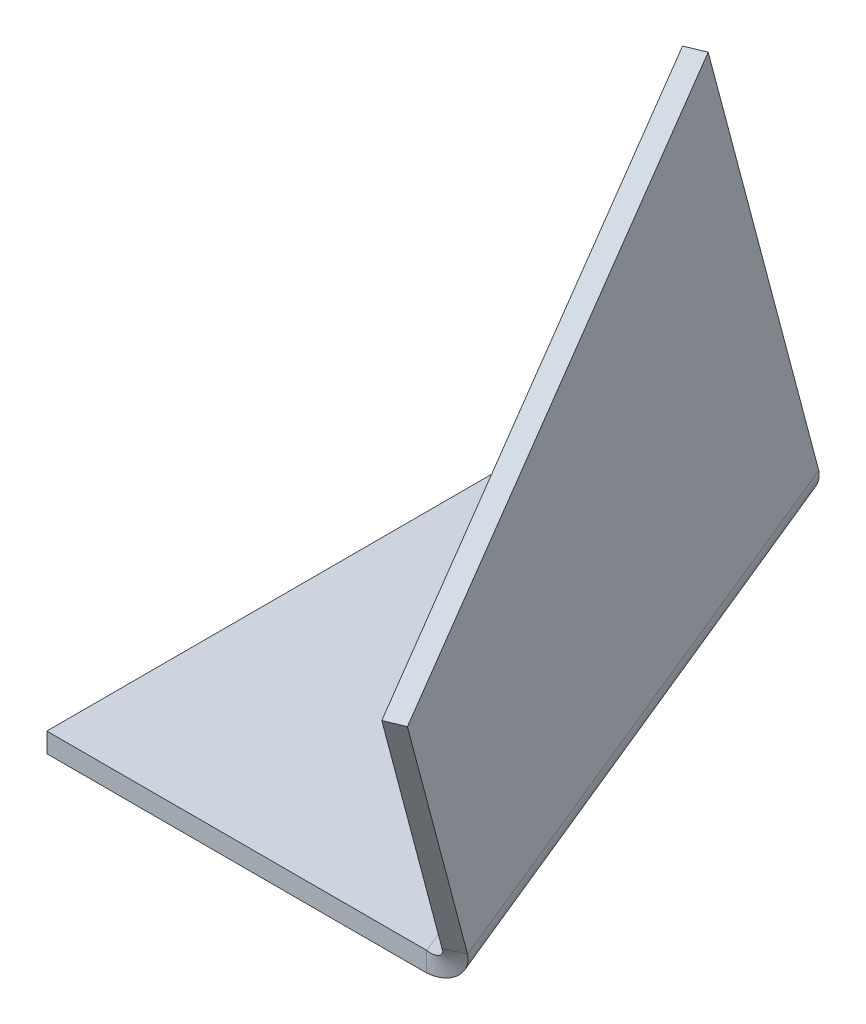
ISO-10303-21;
HEADER;
FILE_DESCRIPTION(('STEP AP214'),'2;1');
FILE_NAME('part.step','',(''),(''),'','','');
FILE_SCHEMA(('AUTOMOTIVE_DESIGN { 1 0 10303 214 1 1 1 1 }'));
ENDSEC;
DATA;
#1=APPLICATION_CONTEXT('core data for automotive mechanical design processes');
#2=APPLICATION_PROTOCOL_DEFINITION('international standard','automotive_design',2000,#1);
#3=PRODUCT_CONTEXT('',#1,'mechanical');
#4=PRODUCT('Part','Part','',(#3));
#5=PRODUCT_RELATED_PRODUCT_CATEGORY('part','',(#4));
#6=PRODUCT_DEFINITION_FORMATION('','',#4);
#7=PRODUCT_DEFINITION_CONTEXT('part definition',#1,'design');
#8=PRODUCT_DEFINITION('design','',#6,#7);
#9=PRODUCT_DEFINITION_SHAPE('','',#8);
#10=(LENGTH_UNIT() NAMED_UNIT(*) SI_UNIT(.MILLI.,.METRE.));
#11=(NAMED_UNIT(*) PLANE_ANGLE_UNIT() SI_UNIT($,.RADIAN.));
#12=(NAMED_UNIT(*) SI_UNIT($,.STERADIAN.) SOLID_ANGLE_UNIT());
#13=UNCERTAINTY_MEASURE_WITH_UNIT(LENGTH_MEASURE(1.E-05),#10,'distance_accuracy_value','');
#14=(GEOMETRIC_REPRESENTATION_CONTEXT(3) GLOBAL_UNCERTAINTY_ASSIGNED_CONTEXT((#13)) GLOBAL_UNIT_ASSIGNED_CONTEXT((#10,
#11,#12)) REPRESENTATION_CONTEXT('',''));
#15=CARTESIAN_POINT('',(0.,0.,0.));
#16=DIRECTION('',(0.,0.,1.));
#17=DIRECTION('',(1.,0.,0.));
#18=AXIS2_PLACEMENT_3D('',#15,#16,#17);
#19=CARTESIAN_POINT('',(27.614547148129,-28.8222551031897,-11.3048892376136));
#20=DIRECTION('',(-0.925452630765146,0.,0.378863337114942));
#21=DIRECTION('',(0.350620072033487,-0.378863337114942,0.856462571790129));
#22=AXIS2_PLACEMENT_3D('',#19,#20,#21);
#23=PLANE('',#22);
#24=DIRECTION('',(0.143537428209867,0.925452630765146,0.350620072033487));
#25=VECTOR('',#24,1.);
#26=CARTESIAN_POINT('',(27.614547148129,-28.8222551031897,-11.3048892376136));
#27=LINE('',#26,#25);
#28=CARTESIAN_POINT('',(32.3254299950118,1.55100000000001,0.202423549824353));
#29=VERTEX_POINT('',#28);
#30=CARTESIAN_POINT('',(35.5103451127041,22.0856306617845,7.98224224877086));
#31=VERTEX_POINT('',#30);
#32=EDGE_CURVE('E74',#29,#31,#27,.T.);
#33=ORIENTED_EDGE('',*,*,#32,.F.);
#34=DIRECTION('',(-0.378863337114942,0.,-0.925452630765146));
#35=VECTOR('',#34,1.);
#36=CARTESIAN_POINT('',(27.6145471481289,1.55100000000001,-11.3048892376135));
#37=LINE('',#36,#35);
#38=CARTESIAN_POINT('',(13.7440473836242,1.55100000000001,-45.1864745998673));
#39=VERTEX_POINT('',#38);
#40=EDGE_CURVE('E67',#29,#39,#37,.T.);
#41=ORIENTED_EDGE('',*,*,#40,.T.);
#42=DIRECTION('',(0.143537428209867,0.925452630765146,0.350620072033487));
#43=VECTOR('',#42,1.);
#44=CARTESIAN_POINT('',(11.7002884093635,-11.6260656822273,-50.1787816776187));
#45=LINE('',#44,#43);
#46=CARTESIAN_POINT('',(19.5960863739386,39.2818200827469,-30.8916501912343));
#47=VERTEX_POINT('',#46);
#48=EDGE_CURVE('E82',#39,#47,#45,.T.);
#49=ORIENTED_EDGE('',*,*,#48,.T.);
#50=DIRECTION('',(0.350620072033487,-0.378863337114942,0.856462571790129));
#51=VECTOR('',#50,1.);
#52=CARTESIAN_POINT('',(35.5103451127041,22.0856306617845,7.98224224877086));
#53=LINE('',#52,#51);
#54=EDGE_CURVE('E450',#31,#47,#53,.F.);
#55=ORIENTED_EDGE('',*,*,#54,.F.);
#56=EDGE_LOOP('',(#33,#41,#49,#55));
#57=FACE_BOUND('',#56,.T.);
#58=ADVANCED_FACE('F55',(#57),#23,.F.);
#59=CARTESIAN_POINT('',(10.3121094632158,-11.6260656822273,-49.6104866719463));
#60=DIRECTION('',(0.350620072033487,-0.378863337114942,0.856462571790129));
#61=DIRECTION('',(0.143537428209867,0.925452630765146,0.350620072033487));
#62=AXIS2_PLACEMENT_3D('',#59,#60,#61);
#63=PLANE('',#62);
#64=CARTESIAN_POINT('',(12.3558684374765,1.55100000000001,-44.6181795941948));
#65=CARTESIAN_POINT('',(13.7440473836242,1.55100000000001,-45.1864745998673));
#66=B_SPLINE_CURVE_WITH_KNOTS('',1,(#64,#65),.UNSPECIFIED.,.F.,.F.,(2,2),(0.,1.),.UNSPECIFIED.);
#67=CARTESIAN_POINT('',(12.3558684374765,1.55100000000001,-44.6181795941949));
#68=VERTEX_POINT('',#67);
#69=EDGE_CURVE('E416',#68,#39,#66,.T.);
#70=ORIENTED_EDGE('',*,*,#69,.F.);
#71=DIRECTION('',(0.143537428209867,0.925452630765146,0.350620072033487));
#72=VECTOR('',#71,1.);
#73=CARTESIAN_POINT('',(10.3121094632158,-11.6260656822273,-49.6104866719463));
#74=LINE('',#73,#72);
#75=CARTESIAN_POINT('',(18.2079074277909,39.2818200827469,-30.3233551855619));
#76=VERTEX_POINT('',#75);
#77=EDGE_CURVE('E466',#68,#76,#74,.T.);
#78=ORIENTED_EDGE('',*,*,#77,.T.);
#79=DIRECTION('',(-0.925452630765146,0.,0.378863337114942));
#80=VECTOR('',#79,1.);
#81=CARTESIAN_POINT('',(18.2079074277909,39.2818200827469,-30.3233551855619));
#82=LINE('',#81,#80);
#83=EDGE_CURVE('E474',#47,#76,#82,.T.);
#84=ORIENTED_EDGE('',*,*,#83,.F.);
#85=ORIENTED_EDGE('',*,*,#48,.F.);
#86=EDGE_LOOP('',(#70,#78,#84,#85));
#87=FACE_BOUND('',#86,.T.);
#88=ADVANCED_FACE('F209',(#87),#63,.F.);
#89=CARTESIAN_POINT('',(26.2263682019813,-28.8222551031897,-10.7365942319412));
#90=DIRECTION('',(0.350620072033487,-0.378863337114942,0.856462571790129));
#91=DIRECTION('',(0.143537428209867,0.925452630765146,0.350620072033487));
#92=AXIS2_PLACEMENT_3D('',#89,#90,#91);
#93=PLANE('',#92);
#94=CARTESIAN_POINT('',(32.3254299950118,1.55100000000001,0.202423549824353));
#95=CARTESIAN_POINT('',(30.9372510488641,1.55100000000001,0.77071855549677));
#96=B_SPLINE_CURVE_WITH_KNOTS('',1,(#94,#95),.UNSPECIFIED.,.F.,.F.,(2,2),(0.,1.),.UNSPECIFIED.);
#97=CARTESIAN_POINT('',(30.9372510488641,1.551,0.770718555496767));
#98=VERTEX_POINT('',#97);
#99=EDGE_CURVE('E12',#29,#98,#96,.T.);
#100=ORIENTED_EDGE('',*,*,#99,.F.);
#101=ORIENTED_EDGE('',*,*,#32,.T.);
#102=DIRECTION('',(-0.925452630765146,0.,0.378863337114942));
#103=VECTOR('',#102,1.);
#104=CARTESIAN_POINT('',(34.1221661665564,22.0856306617845,8.55053725444327));
#105=LINE('',#104,#103);
#106=CARTESIAN_POINT('',(34.1221661665564,22.0856306617845,8.55053725444327));
#107=VERTEX_POINT('',#106);
#108=EDGE_CURVE('E472',#31,#107,#105,.T.);
#109=ORIENTED_EDGE('',*,*,#108,.T.);
#110=DIRECTION('',(0.143537428209867,0.925452630765146,0.350620072033487));
#111=VECTOR('',#110,1.);
#112=CARTESIAN_POINT('',(26.2263682019813,-28.8222551031897,-10.7365942319412));
#113=LINE('',#112,#111);
#114=EDGE_CURVE('E463',#98,#107,#113,.T.);
#115=ORIENTED_EDGE('',*,*,#114,.F.);
#116=EDGE_LOOP('',(#100,#101,#109,#115));
#117=FACE_BOUND('',#116,.T.);
#118=ADVANCED_FACE('F57',(#117),#93,.T.);
#119=CARTESIAN_POINT('',(34.1221661665564,22.0856306617845,8.55053725444327));
#120=DIRECTION('',(0.143537428209867,0.925452630765146,0.350620072033487));
#121=DIRECTION('',(-0.350620072033487,0.378863337114942,-0.856462571790129));
#122=AXIS2_PLACEMENT_3D('',#119,#120,#121);
#123=PLANE('',#122);
#124=ORIENTED_EDGE('',*,*,#54,.T.);
#125=ORIENTED_EDGE('',*,*,#83,.T.);
#126=DIRECTION('',(-0.350620072033487,0.378863337114942,-0.856462571790129));
#127=VECTOR('',#126,1.);
#128=CARTESIAN_POINT('',(34.1221661665564,22.0856306617845,8.55053725444327));
#129=LINE('',#128,#127);
#130=EDGE_CURVE('E471',#107,#76,#129,.T.);
#131=ORIENTED_EDGE('',*,*,#130,.F.);
#132=ORIENTED_EDGE('',*,*,#108,.F.);
#133=EDGE_LOOP('',(#124,#125,#131,#132));
#134=FACE_BOUND('',#133,.T.);
#135=ADVANCED_FACE('F201',(#134),#123,.T.);
#136=CARTESIAN_POINT('',(26.2263682019813,-28.8222551031897,-10.7365942319412));
#137=DIRECTION('',(-0.925452630765146,0.,0.378863337114942));
#138=DIRECTION('',(0.350620072033487,-0.378863337114942,0.856462571790129));
#139=AXIS2_PLACEMENT_3D('',#136,#137,#138);
#140=PLANE('',#139);
#141=DIRECTION('',(-0.378863337114942,0.,-0.925452630765146));
#142=VECTOR('',#141,1.);
#143=CARTESIAN_POINT('',(26.2263682019812,1.551,-10.7365942319411));
#144=LINE('',#143,#142);
#145=EDGE_CURVE('E151',#98,#68,#144,.T.);
#146=ORIENTED_EDGE('',*,*,#145,.F.);
#147=ORIENTED_EDGE('',*,*,#114,.T.);
#148=ORIENTED_EDGE('',*,*,#130,.T.);
#149=ORIENTED_EDGE('',*,*,#77,.F.);
#150=EDGE_LOOP('',(#146,#147,#148,#149));
#151=FACE_BOUND('',#150,.T.);
#152=ADVANCED_FACE('F204',(#151),#140,.T.);
#153=CARTESIAN_POINT('',(0.,0.051,0.));
#154=DIRECTION('',(1.,0.,0.));
#155=DIRECTION('',(0.,0.,-1.));
#156=AXIS2_PLACEMENT_3D('',#153,#154,#155);
#157=PLANE('',#156);
#158=DIRECTION('',(0.,1.,0.));
#159=VECTOR('',#158,1.);
#160=CARTESIAN_POINT('',(0.,0.051,-45.3888981496916));
#161=LINE('',#160,#159);
#162=CARTESIAN_POINT('',(0.,-1.449,-45.3888981496916));
#163=VERTEX_POINT('',#162);
#164=CARTESIAN_POINT('',(0.,0.051,-45.3888981496916));
#165=VERTEX_POINT('',#164);
#166=EDGE_CURVE('E139',#163,#165,#161,.T.);
#167=ORIENTED_EDGE('',*,*,#166,.F.);
#168=DIRECTION('',(0.,0.,1.));
#169=VECTOR('',#168,1.);
#170=CARTESIAN_POINT('',(0.,-1.449,0.));
#171=LINE('',#170,#169);
#172=CARTESIAN_POINT('',(0.,-1.449,0.));
#173=VERTEX_POINT('',#172);
#174=EDGE_CURVE('E420',#173,#163,#171,.F.);
#175=ORIENTED_EDGE('',*,*,#174,.F.);
#176=DIRECTION('',(0.,1.,0.));
#177=VECTOR('',#176,1.);
#178=CARTESIAN_POINT('',(0.,0.051,0.));
#179=LINE('',#178,#177);
#180=CARTESIAN_POINT('',(0.,0.051,0.));
#181=VERTEX_POINT('',#180);
#182=EDGE_CURVE('E431',#173,#181,#179,.T.);
#183=ORIENTED_EDGE('',*,*,#182,.T.);
#184=DIRECTION('',(0.,0.,-1.));
#185=VECTOR('',#184,1.);
#186=CARTESIAN_POINT('',(0.,0.051,0.));
#187=LINE('',#186,#185);
#188=EDGE_CURVE('E175',#181,#165,#187,.T.);
#189=ORIENTED_EDGE('',*,*,#188,.T.);
#190=EDGE_LOOP('',(#167,#175,#183,#189));
#191=FACE_BOUND('',#190,.T.);
#192=ADVANCED_FACE('F207',(#191),#157,.F.);
#193=CARTESIAN_POINT('',(0.,0.051,0.));
#194=DIRECTION('',(0.,1.,0.));
#195=DIRECTION('',(0.,0.,1.));
#196=AXIS2_PLACEMENT_3D('',#193,#194,#195);
#197=PLANE('',#196);
#198=DIRECTION('',(1.,0.,0.));
#199=VECTOR('',#198,1.);
#200=CARTESIAN_POINT('',(0.,0.051,0.));
#201=LINE('',#200,#199);
#202=CARTESIAN_POINT('',(29.0009045041141,0.051,0.));
#203=VERTEX_POINT('',#202);
#204=EDGE_CURVE('E164',#181,#203,#201,.T.);
#205=ORIENTED_EDGE('',*,*,#204,.T.);
#206=DIRECTION('',(-0.378863337114942,0.,-0.925452630765146));
#207=VECTOR('',#206,1.);
#208=CARTESIAN_POINT('',(24.8381892558335,0.051,-10.1682992262687));
#209=LINE('',#208,#207);
#210=CARTESIAN_POINT('',(10.4195218927265,0.051,-45.3888981496916));
#211=VERTEX_POINT('',#210);
#212=EDGE_CURVE('E149',#203,#211,#209,.T.);
#213=ORIENTED_EDGE('',*,*,#212,.T.);
#214=DIRECTION('',(1.,0.,0.));
#215=VECTOR('',#214,1.);
#216=CARTESIAN_POINT('',(0.,0.051,-45.3888981496916));
#217=LINE('',#216,#215);
#218=EDGE_CURVE('E140',#165,#211,#217,.T.);
#219=ORIENTED_EDGE('',*,*,#218,.F.);
#220=ORIENTED_EDGE('',*,*,#188,.F.);
#221=EDGE_LOOP('',(#205,#213,#219,#220));
#222=FACE_BOUND('',#221,.T.);
#223=ADVANCED_FACE('F160',(#222),#197,.T.);
#224=CARTESIAN_POINT('',(0.,0.051,-45.3888981496916));
#225=DIRECTION('',(0.,0.,1.));
#226=DIRECTION('',(1.,0.,0.));
#227=AXIS2_PLACEMENT_3D('',#224,#225,#226);
#228=PLANE('',#227);
#229=ORIENTED_EDGE('',*,*,#218,.T.);
#230=CARTESIAN_POINT('',(10.4195218927265,-1.449,-45.3888981496916));
#231=CARTESIAN_POINT('',(10.4195218927265,0.051,-45.3888981496916));
#232=B_SPLINE_CURVE_WITH_KNOTS('',1,(#230,#231),.UNSPECIFIED.,.F.,.F.,(2,2),(0.,1.),.UNSPECIFIED.);
#233=CARTESIAN_POINT('',(10.4195218927265,-1.449,-45.3888981496916));
#234=VERTEX_POINT('',#233);
#235=EDGE_CURVE('E124',#211,#234,#232,.F.);
#236=ORIENTED_EDGE('',*,*,#235,.T.);
#237=DIRECTION('',(1.,0.,0.));
#238=VECTOR('',#237,1.);
#239=CARTESIAN_POINT('',(0.,-1.449,-45.3888981496916));
#240=LINE('',#239,#238);
#241=EDGE_CURVE('E428',#163,#234,#240,.T.);
#242=ORIENTED_EDGE('',*,*,#241,.F.);
#243=ORIENTED_EDGE('',*,*,#166,.T.);
#244=EDGE_LOOP('',(#229,#236,#242,#243));
#245=FACE_BOUND('',#244,.T.);
#246=ADVANCED_FACE('F167',(#245),#228,.F.);
#247=CARTESIAN_POINT('',(0.,-1.449,0.));
#248=DIRECTION('',(0.,1.,0.));
#249=DIRECTION('',(0.,0.,1.));
#250=AXIS2_PLACEMENT_3D('',#247,#248,#249);
#251=PLANE('',#250);
#252=DIRECTION('',(-0.378863337114942,0.,-0.925452630765146));
#253=VECTOR('',#252,1.);
#254=CARTESIAN_POINT('',(24.8381892558335,-1.449,-10.1682992262687));
#255=LINE('',#254,#253);
#256=CARTESIAN_POINT('',(29.0009045041141,-1.449,0.));
#257=VERTEX_POINT('',#256);
#258=EDGE_CURVE('E153',#257,#234,#255,.T.);
#259=ORIENTED_EDGE('',*,*,#258,.F.);
#260=DIRECTION('',(1.,0.,0.));
#261=VECTOR('',#260,1.);
#262=CARTESIAN_POINT('',(0.,-1.449,0.));
#263=LINE('',#262,#261);
#264=EDGE_CURVE('E186',#173,#257,#263,.T.);
#265=ORIENTED_EDGE('',*,*,#264,.F.);
#266=ORIENTED_EDGE('',*,*,#174,.T.);
#267=ORIENTED_EDGE('',*,*,#241,.T.);
#268=EDGE_LOOP('',(#259,#265,#266,#267));
#269=FACE_BOUND('',#268,.T.);
#270=ADVANCED_FACE('F199',(#269),#251,.F.);
#271=CARTESIAN_POINT('',(0.,0.051,0.));
#272=DIRECTION('',(0.,0.,1.));
#273=DIRECTION('',(1.,0.,0.));
#274=AXIS2_PLACEMENT_3D('',#271,#272,#273);
#275=PLANE('',#274);
#276=ORIENTED_EDGE('',*,*,#264,.T.);
#277=CARTESIAN_POINT('',(29.0009045041141,0.051,0.));
#278=CARTESIAN_POINT('',(29.0009045041141,-1.449,0.));
#279=B_SPLINE_CURVE_WITH_KNOTS('',1,(#277,#278),.UNSPECIFIED.,.F.,.F.,(2,2),(0.,1.),.UNSPECIFIED.);
#280=EDGE_CURVE('E181',#257,#203,#279,.F.);
#281=ORIENTED_EDGE('',*,*,#280,.T.);
#282=ORIENTED_EDGE('',*,*,#204,.F.);
#283=ORIENTED_EDGE('',*,*,#182,.F.);
#284=EDGE_LOOP('',(#276,#281,#282,#283));
#285=FACE_BOUND('',#284,.T.);
#286=ADVANCED_FACE('F188',(#285),#275,.T.);
#287=CARTESIAN_POINT('',(29.0009045041141,-1.449,0.));
#288=CARTESIAN_POINT('',(29.4100769416565,-1.449,-0.0372009495371875));
#289=CARTESIAN_POINT('',(29.8189715750803,-1.37091803000495,-0.0743311039918696));
#290=CARTESIAN_POINT('',(30.581853567844,-1.07035916506277,-0.126070448890172));
#291=CARTESIAN_POINT('',(30.935509306385,-0.848000527194538,-0.140565346274388));
#292=CARTESIAN_POINT('',(31.5408302857312,-0.29264015992474,-0.127802101458073));
#293=CARTESIAN_POINT('',(31.7922933053366,0.0401430588873094,-0.100461173606402));
#294=CARTESIAN_POINT('',(32.1618075640309,0.76575634692217,0.00883701868365594));
#295=CARTESIAN_POINT('',(32.2797418352391,1.15823621535432,0.0908207012127801));
#296=CARTESIAN_POINT('',(32.3254299950118,1.55100000000001,0.202423549824353));
#297=CARTESIAN_POINT('',(29.0009045041141,0.051,0.));
#298=CARTESIAN_POINT('',(29.2283271082656,0.0510000000000001,0.037199690940906));
#299=CARTESIAN_POINT('',(29.4556186728141,0.090040984997527,0.0744189114348337));
#300=CARTESIAN_POINT('',(29.8827403024128,0.240320417468615,0.160133702416447));
#301=CARTESIAN_POINT('',(30.0824084882917,0.351499736402731,0.208678485439724));
#302=CARTESIAN_POINT('',(30.4307496111817,0.62917992003763,0.326644571278646));
#303=CARTESIAN_POINT('',(30.5793214375928,0.795571529443655,0.396107266919863));
#304=CARTESIAN_POINT('',(30.8097592001568,1.15837817346108,0.562340826495657));
#305=CARTESIAN_POINT('',(30.8915644348301,1.35462475174201,0.659119482674068));
#306=CARTESIAN_POINT('',(30.9372510488641,1.55100000000001,0.77071855549677));
#307=B_SPLINE_SURFACE_WITH_KNOTS('',1,3,((#287,#288,#289,#290,#291,#292,#293,#294,#295,#296),
(#297,#298,#299,#300,#301,#302,#303,#304,#305,#306)),.UNSPECIFIED.,.F.,.F.,.F.,(2,2),(4,2,2,2,
4),(0.,1.),(0.,0.25,0.5,0.75,1.),.UNSPECIFIED.);
#308=CARTESIAN_POINT('',(29.0009045041141,-1.449,0.));
#309=CARTESIAN_POINT('',(29.4100769416565,-1.449,-0.0372009495371875));
#310=CARTESIAN_POINT('',(29.8189715750803,-1.37091803000495,-0.0743311039918696));
#311=CARTESIAN_POINT('',(30.581853567844,-1.07035916506277,-0.126070448890172));
#312=CARTESIAN_POINT('',(30.935509306385,-0.848000527194538,-0.140565346274388));
#313=CARTESIAN_POINT('',(31.5408302857312,-0.29264015992474,-0.127802101458073));
#314=CARTESIAN_POINT('',(31.7922933053366,0.0401430588873094,-0.100461173606402));
#315=CARTESIAN_POINT('',(32.1618075640309,0.76575634692217,0.00883701868365594));
#316=CARTESIAN_POINT('',(32.2797418352391,1.15823621535432,0.0908207012127801));
#317=CARTESIAN_POINT('',(32.3254299950118,1.55100000000001,0.202423549824353));
#318=B_SPLINE_CURVE_WITH_KNOTS('',3,(#308,#309,#310,#311,#312,#313,#314,#315,#316,#317),
.UNSPECIFIED.,.F.,.F.,(4,2,2,2,4),(0.,0.25,0.5,0.75,1.),.UNSPECIFIED.);
#319=EDGE_CURVE('E497',#257,#29,#318,.T.);
#320=CARTESIAN_POINT('',(30.9372510488641,1.55100000000001,0.77071855549677));
#321=CARTESIAN_POINT('',(30.8915644348301,1.35462475174201,0.659119482674068));
#322=CARTESIAN_POINT('',(30.8097592001568,1.15837817346108,0.562340826495657));
#323=CARTESIAN_POINT('',(30.5793214375928,0.795571529443655,0.396107266919863));
#324=CARTESIAN_POINT('',(30.4307496111817,0.62917992003763,0.326644571278646));
#325=CARTESIAN_POINT('',(30.0824084882917,0.351499736402731,0.208678485439724));
#326=CARTESIAN_POINT('',(29.8827403024128,0.240320417468615,0.160133702416447));
#327=CARTESIAN_POINT('',(29.4556186728141,0.090040984997527,0.0744189114348337));
#328=CARTESIAN_POINT('',(29.2283271082656,0.0510000000000001,0.037199690940906));
#329=CARTESIAN_POINT('',(29.0009045041141,0.051,0.));
#330=B_SPLINE_CURVE_WITH_KNOTS('',3,(#320,#321,#322,#323,#324,#325,#326,#327,#328,#329),
.UNSPECIFIED.,.F.,.F.,(4,2,2,2,4),(0.,0.25,0.5,0.75,1.),.UNSPECIFIED.);
#331=EDGE_CURVE('E154',#203,#98,#330,.F.);
#332=ORIENTED_EDGE('',*,*,#280,.F.);
#333=ORIENTED_EDGE('',*,*,#319,.T.);
#334=ORIENTED_EDGE('',*,*,#99,.T.);
#335=ORIENTED_EDGE('',*,*,#331,.F.);
#336=EDGE_LOOP('',(#332,#333,#334,#335));
#337=FACE_BOUND('',#336,.T.);
#338=ADVANCED_FACE('F198',(#337),#307,.F.);
#339=CARTESIAN_POINT('',(13.7440473836242,1.55100000000001,-45.1864745998673));
#340=CARTESIAN_POINT('',(13.6983592238515,1.15823621535431,-45.2980774484788));
#341=CARTESIAN_POINT('',(13.5804249526433,0.765756346922169,-45.380061131008));
#342=CARTESIAN_POINT('',(13.210910693949,0.0401430588873099,-45.489359323298));
#343=CARTESIAN_POINT('',(12.9594476743436,-0.292640159924741,-45.5167002511497));
#344=CARTESIAN_POINT('',(12.3541266949974,-0.848000527194537,-45.529463495966));
#345=CARTESIAN_POINT('',(12.0004709564564,-1.07035916506277,-45.5149685985818));
#346=CARTESIAN_POINT('',(11.2375889636927,-1.37091803000495,-45.4632292536835));
#347=CARTESIAN_POINT('',(10.8286943302689,-1.449,-45.4260990992288));
#348=CARTESIAN_POINT('',(10.4195218927265,-1.449,-45.3888981496916));
#349=CARTESIAN_POINT('',(12.3558684374765,1.55100000000001,-44.6181795941948));
#350=CARTESIAN_POINT('',(12.3101818234425,1.354624751742,-44.7297786670175));
#351=CARTESIAN_POINT('',(12.2283765887692,1.15837817346108,-44.8265573231959));
#352=CARTESIAN_POINT('',(11.9979388262052,0.795571529443655,-44.9927908827717));
#353=CARTESIAN_POINT('',(11.8493669997941,0.62917992003763,-45.062253578413));
#354=CARTESIAN_POINT('',(11.5010258769041,0.351499736402731,-45.1802196642519));
#355=CARTESIAN_POINT('',(11.3013576910252,0.240320417468614,-45.2287644472752));
#356=CARTESIAN_POINT('',(10.8742360614265,0.090040984997527,-45.3144792382568));
#357=CARTESIAN_POINT('',(10.646944496878,0.0510000000000001,-45.3516984587507));
#358=CARTESIAN_POINT('',(10.4195218927265,0.051,-45.3888981496916));
#359=B_SPLINE_SURFACE_WITH_KNOTS('',1,3,((#339,#340,#341,#342,#343,#344,#345,#346,#347,#348),
(#349,#350,#351,#352,#353,#354,#355,#356,#357,#358)),.UNSPECIFIED.,.F.,.F.,.F.,(2,2),(4,2,2,2,
4),(0.,1.),(0.,0.25,0.5,0.75,1.),.UNSPECIFIED.);
#360=CARTESIAN_POINT('',(13.7440473836242,1.55100000000001,-45.1864745998673));
#361=CARTESIAN_POINT('',(13.6983592238515,1.15823621535431,-45.2980774484788));
#362=CARTESIAN_POINT('',(13.5804249526433,0.765756346922169,-45.380061131008));
#363=CARTESIAN_POINT('',(13.210910693949,0.0401430588873099,-45.489359323298));
#364=CARTESIAN_POINT('',(12.9594476743436,-0.292640159924741,-45.5167002511497));
#365=CARTESIAN_POINT('',(12.3541266949974,-0.848000527194537,-45.529463495966));
#366=CARTESIAN_POINT('',(12.0004709564564,-1.07035916506277,-45.5149685985818));
#367=CARTESIAN_POINT('',(11.2375889636927,-1.37091803000495,-45.4632292536835));
#368=CARTESIAN_POINT('',(10.8286943302689,-1.449,-45.4260990992288));
#369=CARTESIAN_POINT('',(10.4195218927265,-1.449,-45.3888981496916));
#370=B_SPLINE_CURVE_WITH_KNOTS('',3,(#360,#361,#362,#363,#364,#365,#366,#367,#368,#369),
.UNSPECIFIED.,.F.,.F.,(4,2,2,2,4),(0.,0.25,0.5,0.75,1.),.UNSPECIFIED.);
#371=EDGE_CURVE('E132',#39,#234,#370,.T.);
#372=CARTESIAN_POINT('',(10.4195218927265,0.051,-45.3888981496916));
#373=CARTESIAN_POINT('',(10.646944496878,0.0510000000000001,-45.3516984587507));
#374=CARTESIAN_POINT('',(10.8742360614265,0.090040984997527,-45.3144792382568));
#375=CARTESIAN_POINT('',(11.3013576910252,0.240320417468614,-45.2287644472752));
#376=CARTESIAN_POINT('',(11.5010258769041,0.351499736402731,-45.1802196642519));
#377=CARTESIAN_POINT('',(11.8493669997941,0.62917992003763,-45.062253578413));
#378=CARTESIAN_POINT('',(11.9979388262052,0.795571529443655,-44.9927908827717));
#379=CARTESIAN_POINT('',(12.2283765887692,1.15837817346108,-44.8265573231959));
#380=CARTESIAN_POINT('',(12.3101818234425,1.354624751742,-44.7297786670175));
#381=CARTESIAN_POINT('',(12.3558684374765,1.55100000000001,-44.6181795941948));
#382=B_SPLINE_CURVE_WITH_KNOTS('',3,(#372,#373,#374,#375,#376,#377,#378,#379,#380,#381),
.UNSPECIFIED.,.F.,.F.,(4,2,2,2,4),(0.,0.25,0.5,0.75,1.),.UNSPECIFIED.);
#383=EDGE_CURVE('E129',#68,#211,#382,.F.);
#384=ORIENTED_EDGE('',*,*,#371,.T.);
#385=ORIENTED_EDGE('',*,*,#235,.F.);
#386=ORIENTED_EDGE('',*,*,#383,.F.);
#387=ORIENTED_EDGE('',*,*,#69,.T.);
#388=EDGE_LOOP('',(#384,#385,#386,#387));
#389=FACE_BOUND('',#388,.T.);
#390=ADVANCED_FACE('F127',(#389),#359,.F.);
#391=CARTESIAN_POINT('',(38.8949886145411,1.551,24.1683617072409));
#392=DIRECTION('',(-0.378863337114942,0.,-0.925452630765146));
#393=DIRECTION('',(-0.925452630765146,0.,0.378863337114942));
#394=AXIS2_PLACEMENT_3D('',#391,#392,#393);
#395=CYLINDRICAL_SURFACE('',#394,1.5);
#396=ORIENTED_EDGE('',*,*,#145,.T.);
#397=ORIENTED_EDGE('',*,*,#383,.T.);
#398=ORIENTED_EDGE('',*,*,#212,.F.);
#399=ORIENTED_EDGE('',*,*,#331,.T.);
#400=EDGE_LOOP('',(#396,#397,#398,#399));
#401=FACE_BOUND('',#400,.T.);
#402=ADVANCED_FACE('F147',(#401),#395,.F.);
#403=CARTESIAN_POINT('',(38.8949886145411,1.551,24.1683617072409));
#404=DIRECTION('',(-0.378863337114942,0.,-0.925452630765146));
#405=DIRECTION('',(-0.925452630765146,0.,0.378863337114942));
#406=AXIS2_PLACEMENT_3D('',#403,#404,#405);
#407=CYLINDRICAL_SURFACE('',#406,3.);
#408=ORIENTED_EDGE('',*,*,#40,.F.);
#409=ORIENTED_EDGE('',*,*,#319,.F.);
#410=ORIENTED_EDGE('',*,*,#258,.T.);
#411=ORIENTED_EDGE('',*,*,#371,.F.);
#412=EDGE_LOOP('',(#408,#409,#410,#411));
#413=FACE_BOUND('',#412,.T.);
#414=ADVANCED_FACE('F280',(#413),#407,.T.);
#415=CLOSED_SHELL('',(#58,#88,#118,#135,#152,#192,#223,#246,#270,#286,#338,#390,#402,#414));
#416=MANIFOLD_SOLID_BREP('B2',#415);
#417=ADVANCED_BREP_SHAPE_REPRESENTATION('',(#18,#416),#14);
#418=SHAPE_DEFINITION_REPRESENTATION(#9,#417);
ENDSEC;
END-ISO-10303-21;
